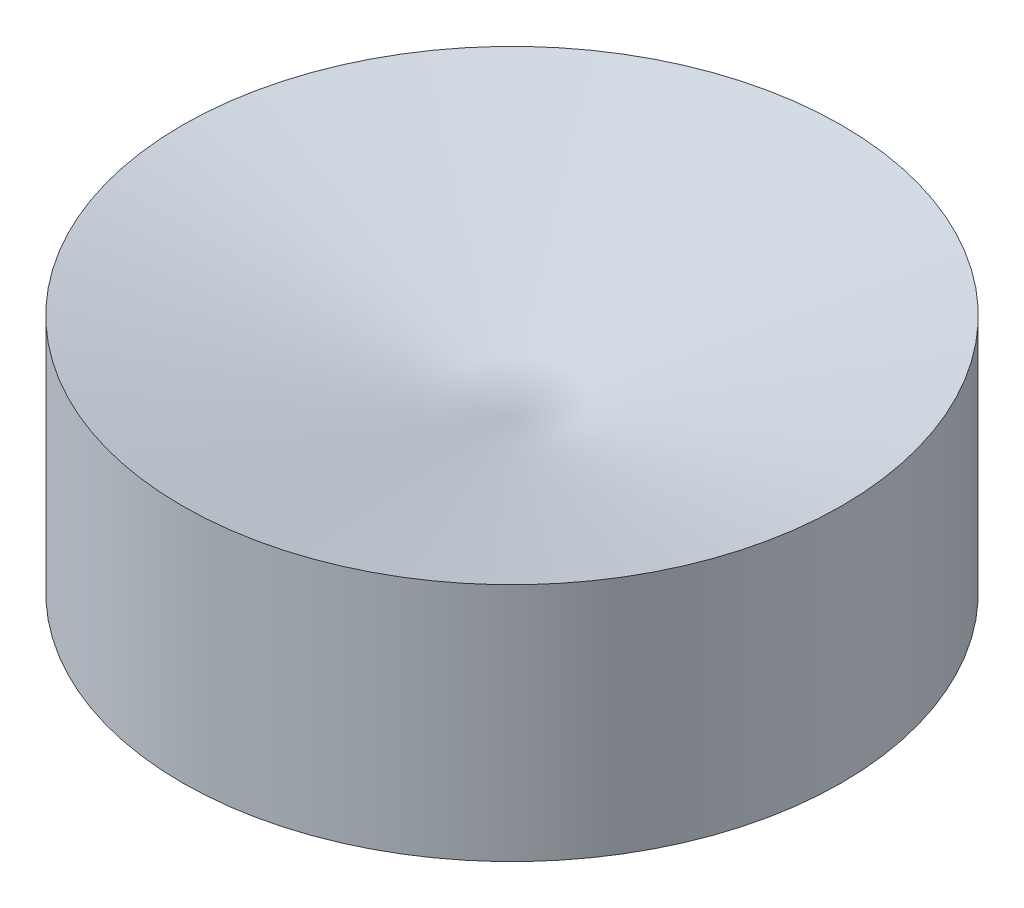
ISO-10303-21;
HEADER;
FILE_DESCRIPTION(('STEP AP214'),'2;1');
FILE_NAME('part.step','',(''),(''),'','','');
FILE_SCHEMA(('AUTOMOTIVE_DESIGN { 1 0 10303 214 1 1 1 1 }'));
ENDSEC;
DATA;
#1=APPLICATION_CONTEXT('core data for automotive mechanical design processes');
#2=APPLICATION_PROTOCOL_DEFINITION('international standard','automotive_design',2000,#1);
#3=PRODUCT_CONTEXT('',#1,'mechanical');
#4=PRODUCT('Part','Part','',(#3));
#5=PRODUCT_RELATED_PRODUCT_CATEGORY('part','',(#4));
#6=PRODUCT_DEFINITION_FORMATION('','',#4);
#7=PRODUCT_DEFINITION_CONTEXT('part definition',#1,'design');
#8=PRODUCT_DEFINITION('design','',#6,#7);
#9=PRODUCT_DEFINITION_SHAPE('','',#8);
#10=(LENGTH_UNIT() NAMED_UNIT(*) SI_UNIT(.MILLI.,.METRE.));
#11=(NAMED_UNIT(*) PLANE_ANGLE_UNIT() SI_UNIT($,.RADIAN.));
#12=(NAMED_UNIT(*) SI_UNIT($,.STERADIAN.) SOLID_ANGLE_UNIT());
#13=UNCERTAINTY_MEASURE_WITH_UNIT(LENGTH_MEASURE(1.E-05),#10,'distance_accuracy_value','');
#14=(GEOMETRIC_REPRESENTATION_CONTEXT(3) GLOBAL_UNCERTAINTY_ASSIGNED_CONTEXT((#13)) GLOBAL_UNIT_ASSIGNED_CONTEXT((#10,
#11,#12)) REPRESENTATION_CONTEXT('',''));
#15=CARTESIAN_POINT('',(0.,0.,0.));
#16=DIRECTION('',(0.,0.,1.));
#17=DIRECTION('',(1.,0.,0.));
#18=AXIS2_PLACEMENT_3D('',#15,#16,#17);
#19=CARTESIAN_POINT('',(0.,5.26279441628844,0.));
#20=DIRECTION('',(0.,1.,0.));
#21=DIRECTION('',(0.,0.,1.));
#22=AXIS2_PLACEMENT_3D('',#19,#20,#21);
#23=CONICAL_SURFACE('',#22,0.,1.30899693899575);
#24=CARTESIAN_POINT('',(0.,20.,0.));
#25=DIRECTION('',(0.,1.,0.));
#26=DIRECTION('',(0.,0.,1.));
#27=AXIS2_PLACEMENT_3D('',#24,#25,#26);
#28=CIRCLE('',#27,55.);
#29=CARTESIAN_POINT('',(0.,20.,55.));
#30=VERTEX_POINT('',#29);
#31=EDGE_CURVE('E11',#30,#30,#28,.T.);
#32=ORIENTED_EDGE('',*,*,#31,.T.);
#33=EDGE_LOOP('',(#32));
#34=FACE_BOUND('',#33,.T.);
#35=CARTESIAN_POINT('',(0.,5.26279441628844,0.));
#36=VERTEX_POINT('',#35);
#37=VERTEX_LOOP('',#36);
#38=FACE_BOUND('',#37,.T.);
#39=ADVANCED_FACE('F35',(#34,#38),#23,.F.);
#40=CARTESIAN_POINT('',(0.,43.071073477192,0.));
#41=DIRECTION('',(0.,1.,0.));
#42=DIRECTION('',(0.,0.,1.));
#43=AXIS2_PLACEMENT_3D('',#40,#41,#42);
#44=CYLINDRICAL_SURFACE('',#43,55.);
#45=CARTESIAN_POINT('',(0.,-20.,0.));
#46=DIRECTION('',(0.,1.,0.));
#47=DIRECTION('',(0.,0.,1.));
#48=AXIS2_PLACEMENT_3D('',#45,#46,#47);
#49=CIRCLE('',#48,55.);
#50=CARTESIAN_POINT('',(0.,-20.,55.));
#51=VERTEX_POINT('',#50);
#52=EDGE_CURVE('E41',#51,#51,#49,.T.);
#53=ORIENTED_EDGE('',*,*,#52,.T.);
#54=EDGE_LOOP('',(#53));
#55=FACE_BOUND('',#54,.T.);
#56=ORIENTED_EDGE('',*,*,#31,.F.);
#57=EDGE_LOOP('',(#56));
#58=FACE_BOUND('',#57,.T.);
#59=ADVANCED_FACE('F45',(#55,#58),#44,.T.);
#60=CARTESIAN_POINT('',(0.,-20.,55.));
#61=DIRECTION('',(0.,-1.,0.));
#62=DIRECTION('',(0.,0.,-1.));
#63=AXIS2_PLACEMENT_3D('',#60,#61,#62);
#64=PLANE('',#63);
#65=ORIENTED_EDGE('',*,*,#52,.F.);
#66=EDGE_LOOP('',(#65));
#67=FACE_BOUND('',#66,.T.);
#68=ADVANCED_FACE('F50',(#67),#64,.T.);
#69=CLOSED_SHELL('',(#39,#59,#68));
#70=MANIFOLD_SOLID_BREP('B2',#69);
#71=ADVANCED_BREP_SHAPE_REPRESENTATION('',(#18,#70),#14);
#72=SHAPE_DEFINITION_REPRESENTATION(#9,#71);
ENDSEC;
END-ISO-10303-21;
